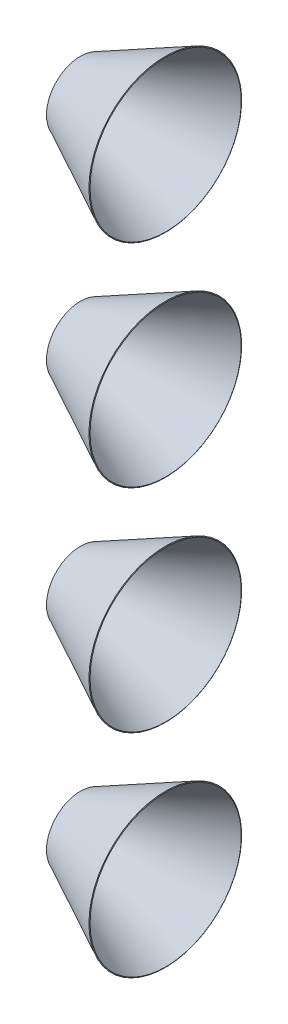
ISO-10303-21;
HEADER;
FILE_DESCRIPTION(('STEP AP214'),'2;1');
FILE_NAME('part.step','',(''),(''),'','','');
FILE_SCHEMA(('AUTOMOTIVE_DESIGN { 1 0 10303 214 1 1 1 1 }'));
ENDSEC;
DATA;
#1=APPLICATION_CONTEXT('core data for automotive mechanical design processes');
#2=APPLICATION_PROTOCOL_DEFINITION('international standard','automotive_design',2000,#1);
#3=PRODUCT_CONTEXT('',#1,'mechanical');
#4=PRODUCT('Part','Part','',(#3));
#5=PRODUCT_RELATED_PRODUCT_CATEGORY('part','',(#4));
#6=PRODUCT_DEFINITION_FORMATION('','',#4);
#7=PRODUCT_DEFINITION_CONTEXT('part definition',#1,'design');
#8=PRODUCT_DEFINITION('design','',#6,#7);
#9=PRODUCT_DEFINITION_SHAPE('','',#8);
#10=(LENGTH_UNIT() NAMED_UNIT(*) SI_UNIT(.MILLI.,.METRE.));
#11=(NAMED_UNIT(*) PLANE_ANGLE_UNIT() SI_UNIT($,.RADIAN.));
#12=(NAMED_UNIT(*) SI_UNIT($,.STERADIAN.) SOLID_ANGLE_UNIT());
#13=UNCERTAINTY_MEASURE_WITH_UNIT(LENGTH_MEASURE(1.E-05),#10,'distance_accuracy_value','');
#14=(GEOMETRIC_REPRESENTATION_CONTEXT(3) GLOBAL_UNCERTAINTY_ASSIGNED_CONTEXT((#13)) GLOBAL_UNIT_ASSIGNED_CONTEXT((#10,
#11,#12)) REPRESENTATION_CONTEXT('',''));
#15=CARTESIAN_POINT('',(0.,0.,0.));
#16=DIRECTION('',(0.,0.,1.));
#17=DIRECTION('',(1.,0.,0.));
#18=AXIS2_PLACEMENT_3D('',#15,#16,#17);
#19=CARTESIAN_POINT('',(1200.4472135955,375.,0.));
#20=DIRECTION('',(1.,0.,0.));
#21=DIRECTION('',(0.,0.,-1.));
#22=AXIS2_PLACEMENT_3D('',#19,#20,#21);
#23=CONICAL_SURFACE('',#22,39.1055728090001,0.463647609000806);
#24=CARTESIAN_POINT('',(1300.4472135955,375.,0.));
#25=DIRECTION('',(-1.,0.,0.));
#26=DIRECTION('',(0.,0.,1.));
#27=AXIS2_PLACEMENT_3D('',#24,#25,#26);
#28=CIRCLE('',#27,89.1055728090001);
#29=CARTESIAN_POINT('',(1300.4472135955,375.,89.1055728090001));
#30=VERTEX_POINT('',#29);
#31=EDGE_CURVE('E56',#30,#30,#28,.T.);
#32=ORIENTED_EDGE('',*,*,#31,.F.);
#33=EDGE_LOOP('',(#32));
#34=FACE_BOUND('',#33,.T.);
#35=CARTESIAN_POINT('',(1200.4472135955,375.,0.));
#36=DIRECTION('',(-1.,0.,0.));
#37=DIRECTION('',(0.,0.,1.));
#38=AXIS2_PLACEMENT_3D('',#35,#36,#37);
#39=CIRCLE('',#38,39.1055728090001);
#40=CARTESIAN_POINT('',(1200.4472135955,375.,39.1055728090001));
#41=VERTEX_POINT('',#40);
#42=EDGE_CURVE('E11',#41,#41,#39,.T.);
#43=ORIENTED_EDGE('',*,*,#42,.T.);
#44=EDGE_LOOP('',(#43));
#45=FACE_BOUND('',#44,.T.);
#46=ADVANCED_FACE('F42',(#34,#45),#23,.F.);
#47=CARTESIAN_POINT('',(1200.4472135955,375.,0.));
#48=DIRECTION('',(-1.,0.,0.));
#49=DIRECTION('',(0.,0.,1.));
#50=AXIS2_PLACEMENT_3D('',#47,#48,#49);
#51=CONICAL_SURFACE('',#50,39.1055728090001,1.10714871779402);
#52=CARTESIAN_POINT('',(1200.,375.,0.));
#53=DIRECTION('',(-1.,0.,0.));
#54=DIRECTION('',(0.,0.,1.));
#55=AXIS2_PLACEMENT_3D('',#52,#53,#54);
#56=CIRCLE('',#55,40.);
#57=CARTESIAN_POINT('',(1200.,375.,40.));
#58=VERTEX_POINT('',#57);
#59=EDGE_CURVE('E48',#58,#58,#56,.T.);
#60=ORIENTED_EDGE('',*,*,#59,.T.);
#61=EDGE_LOOP('',(#60));
#62=FACE_BOUND('',#61,.T.);
#63=ORIENTED_EDGE('',*,*,#42,.F.);
#64=EDGE_LOOP('',(#63));
#65=FACE_BOUND('',#64,.T.);
#66=ADVANCED_FACE('F66',(#62,#65),#51,.F.);
#67=CARTESIAN_POINT('',(1200.,375.,0.));
#68=DIRECTION('',(1.,0.,0.));
#69=DIRECTION('',(0.,0.,-1.));
#70=AXIS2_PLACEMENT_3D('',#67,#68,#69);
#71=CONICAL_SURFACE('',#70,40.,0.463647609000806);
#72=CARTESIAN_POINT('',(1300.,375.,0.));
#73=DIRECTION('',(-1.,0.,0.));
#74=DIRECTION('',(0.,0.,1.));
#75=AXIS2_PLACEMENT_3D('',#72,#73,#74);
#76=CIRCLE('',#75,90.);
#77=CARTESIAN_POINT('',(1300.,375.,90.));
#78=VERTEX_POINT('',#77);
#79=EDGE_CURVE('E52',#78,#78,#76,.T.);
#80=ORIENTED_EDGE('',*,*,#79,.T.);
#81=EDGE_LOOP('',(#80));
#82=FACE_BOUND('',#81,.T.);
#83=ORIENTED_EDGE('',*,*,#59,.F.);
#84=EDGE_LOOP('',(#83));
#85=FACE_BOUND('',#84,.T.);
#86=ADVANCED_FACE('F70',(#82,#85),#71,.T.);
#87=CARTESIAN_POINT('',(1300.,375.,0.));
#88=DIRECTION('',(-1.,0.,0.));
#89=DIRECTION('',(0.,0.,1.));
#90=AXIS2_PLACEMENT_3D('',#87,#88,#89);
#91=CONICAL_SURFACE('',#90,90.,1.10714871779402);
#92=ORIENTED_EDGE('',*,*,#31,.T.);
#93=EDGE_LOOP('',(#92));
#94=FACE_BOUND('',#93,.T.);
#95=ORIENTED_EDGE('',*,*,#79,.F.);
#96=EDGE_LOOP('',(#95));
#97=FACE_BOUND('',#96,.T.);
#98=ADVANCED_FACE('F62',(#94,#97),#91,.T.);
#99=CLOSED_SHELL('',(#46,#66,#86,#98));
#100=MANIFOLD_SOLID_BREP('B2',#99);
#101=CARTESIAN_POINT('',(1200.4472135955,125.,0.));
#102=DIRECTION('',(1.,0.,0.));
#103=DIRECTION('',(0.,0.,-1.));
#104=AXIS2_PLACEMENT_3D('',#101,#102,#103);
#105=CONICAL_SURFACE('',#104,39.1055728090001,0.463647609000806);
#106=CARTESIAN_POINT('',(1300.4472135955,125.,0.));
#107=DIRECTION('',(-1.,0.,0.));
#108=DIRECTION('',(0.,0.,1.));
#109=AXIS2_PLACEMENT_3D('',#106,#107,#108);
#110=CIRCLE('',#109,89.1055728090001);
#111=CARTESIAN_POINT('',(1300.4472135955,125.,89.1055728090001));
#112=VERTEX_POINT('',#111);
#113=EDGE_CURVE('E125',#112,#112,#110,.T.);
#114=ORIENTED_EDGE('',*,*,#113,.F.);
#115=EDGE_LOOP('',(#114));
#116=FACE_BOUND('',#115,.T.);
#117=CARTESIAN_POINT('',(1200.4472135955,125.,0.));
#118=DIRECTION('',(-1.,0.,0.));
#119=DIRECTION('',(0.,0.,1.));
#120=AXIS2_PLACEMENT_3D('',#117,#118,#119);
#121=CIRCLE('',#120,39.1055728090001);
#122=CARTESIAN_POINT('',(1200.4472135955,125.,39.1055728090001));
#123=VERTEX_POINT('',#122);
#124=EDGE_CURVE('E41',#123,#123,#121,.T.);
#125=ORIENTED_EDGE('',*,*,#124,.T.);
#126=EDGE_LOOP('',(#125));
#127=FACE_BOUND('',#126,.T.);
#128=ADVANCED_FACE('F111',(#116,#127),#105,.F.);
#129=CARTESIAN_POINT('',(1200.4472135955,125.,0.));
#130=DIRECTION('',(-1.,0.,0.));
#131=DIRECTION('',(0.,0.,1.));
#132=AXIS2_PLACEMENT_3D('',#129,#130,#131);
#133=CONICAL_SURFACE('',#132,39.1055728090001,1.10714871779402);
#134=CARTESIAN_POINT('',(1200.,125.,0.));
#135=DIRECTION('',(-1.,0.,0.));
#136=DIRECTION('',(0.,0.,1.));
#137=AXIS2_PLACEMENT_3D('',#134,#135,#136);
#138=CIRCLE('',#137,40.);
#139=CARTESIAN_POINT('',(1200.,125.,40.));
#140=VERTEX_POINT('',#139);
#141=EDGE_CURVE('E117',#140,#140,#138,.T.);
#142=ORIENTED_EDGE('',*,*,#141,.T.);
#143=EDGE_LOOP('',(#142));
#144=FACE_BOUND('',#143,.T.);
#145=ORIENTED_EDGE('',*,*,#124,.F.);
#146=EDGE_LOOP('',(#145));
#147=FACE_BOUND('',#146,.T.);
#148=ADVANCED_FACE('F135',(#144,#147),#133,.F.);
#149=CARTESIAN_POINT('',(1200.,125.,0.));
#150=DIRECTION('',(1.,0.,0.));
#151=DIRECTION('',(0.,0.,-1.));
#152=AXIS2_PLACEMENT_3D('',#149,#150,#151);
#153=CONICAL_SURFACE('',#152,40.,0.463647609000806);
#154=CARTESIAN_POINT('',(1300.,125.,0.));
#155=DIRECTION('',(-1.,0.,0.));
#156=DIRECTION('',(0.,0.,1.));
#157=AXIS2_PLACEMENT_3D('',#154,#155,#156);
#158=CIRCLE('',#157,90.);
#159=CARTESIAN_POINT('',(1300.,125.,90.));
#160=VERTEX_POINT('',#159);
#161=EDGE_CURVE('E121',#160,#160,#158,.T.);
#162=ORIENTED_EDGE('',*,*,#161,.T.);
#163=EDGE_LOOP('',(#162));
#164=FACE_BOUND('',#163,.T.);
#165=ORIENTED_EDGE('',*,*,#141,.F.);
#166=EDGE_LOOP('',(#165));
#167=FACE_BOUND('',#166,.T.);
#168=ADVANCED_FACE('F139',(#164,#167),#153,.T.);
#169=CARTESIAN_POINT('',(1300.,125.,0.));
#170=DIRECTION('',(-1.,0.,0.));
#171=DIRECTION('',(0.,0.,1.));
#172=AXIS2_PLACEMENT_3D('',#169,#170,#171);
#173=CONICAL_SURFACE('',#172,90.,1.10714871779402);
#174=ORIENTED_EDGE('',*,*,#113,.T.);
#175=EDGE_LOOP('',(#174));
#176=FACE_BOUND('',#175,.T.);
#177=ORIENTED_EDGE('',*,*,#161,.F.);
#178=EDGE_LOOP('',(#177));
#179=FACE_BOUND('',#178,.T.);
#180=ADVANCED_FACE('F131',(#176,#179),#173,.T.);
#181=CLOSED_SHELL('',(#128,#148,#168,#180));
#182=MANIFOLD_SOLID_BREP('B6',#181);
#183=CARTESIAN_POINT('',(1200.4472135955,-125.,0.));
#184=DIRECTION('',(1.,0.,0.));
#185=DIRECTION('',(0.,0.,-1.));
#186=AXIS2_PLACEMENT_3D('',#183,#184,#185);
#187=CONICAL_SURFACE('',#186,39.1055728090001,0.463647609000806);
#188=CARTESIAN_POINT('',(1300.4472135955,-125.,0.));
#189=DIRECTION('',(-1.,0.,0.));
#190=DIRECTION('',(0.,0.,1.));
#191=AXIS2_PLACEMENT_3D('',#188,#189,#190);
#192=CIRCLE('',#191,89.1055728090001);
#193=CARTESIAN_POINT('',(1300.4472135955,-125.,89.1055728090001));
#194=VERTEX_POINT('',#193);
#195=EDGE_CURVE('E193',#194,#194,#192,.T.);
#196=ORIENTED_EDGE('',*,*,#195,.F.);
#197=EDGE_LOOP('',(#196));
#198=FACE_BOUND('',#197,.T.);
#199=CARTESIAN_POINT('',(1200.4472135955,-125.,0.));
#200=DIRECTION('',(-1.,0.,0.));
#201=DIRECTION('',(0.,0.,1.));
#202=AXIS2_PLACEMENT_3D('',#199,#200,#201);
#203=CIRCLE('',#202,39.1055728090001);
#204=CARTESIAN_POINT('',(1200.4472135955,-125.,39.1055728090001));
#205=VERTEX_POINT('',#204);
#206=EDGE_CURVE('E110',#205,#205,#203,.T.);
#207=ORIENTED_EDGE('',*,*,#206,.T.);
#208=EDGE_LOOP('',(#207));
#209=FACE_BOUND('',#208,.T.);
#210=ADVANCED_FACE('F179',(#198,#209),#187,.F.);
#211=CARTESIAN_POINT('',(1200.4472135955,-125.,0.));
#212=DIRECTION('',(-1.,0.,0.));
#213=DIRECTION('',(0.,0.,1.));
#214=AXIS2_PLACEMENT_3D('',#211,#212,#213);
#215=CONICAL_SURFACE('',#214,39.1055728090001,1.10714871779402);
#216=CARTESIAN_POINT('',(1200.,-125.,0.));
#217=DIRECTION('',(-1.,0.,0.));
#218=DIRECTION('',(0.,0.,1.));
#219=AXIS2_PLACEMENT_3D('',#216,#217,#218);
#220=CIRCLE('',#219,40.);
#221=CARTESIAN_POINT('',(1200.,-125.,40.));
#222=VERTEX_POINT('',#221);
#223=EDGE_CURVE('E185',#222,#222,#220,.T.);
#224=ORIENTED_EDGE('',*,*,#223,.T.);
#225=EDGE_LOOP('',(#224));
#226=FACE_BOUND('',#225,.T.);
#227=ORIENTED_EDGE('',*,*,#206,.F.);
#228=EDGE_LOOP('',(#227));
#229=FACE_BOUND('',#228,.T.);
#230=ADVANCED_FACE('F203',(#226,#229),#215,.F.);
#231=CARTESIAN_POINT('',(1200.,-125.,0.));
#232=DIRECTION('',(1.,0.,0.));
#233=DIRECTION('',(0.,0.,-1.));
#234=AXIS2_PLACEMENT_3D('',#231,#232,#233);
#235=CONICAL_SURFACE('',#234,40.,0.463647609000806);
#236=CARTESIAN_POINT('',(1300.,-125.,0.));
#237=DIRECTION('',(-1.,0.,0.));
#238=DIRECTION('',(0.,0.,1.));
#239=AXIS2_PLACEMENT_3D('',#236,#237,#238);
#240=CIRCLE('',#239,90.);
#241=CARTESIAN_POINT('',(1300.,-125.,90.));
#242=VERTEX_POINT('',#241);
#243=EDGE_CURVE('E189',#242,#242,#240,.T.);
#244=ORIENTED_EDGE('',*,*,#243,.T.);
#245=EDGE_LOOP('',(#244));
#246=FACE_BOUND('',#245,.T.);
#247=ORIENTED_EDGE('',*,*,#223,.F.);
#248=EDGE_LOOP('',(#247));
#249=FACE_BOUND('',#248,.T.);
#250=ADVANCED_FACE('F207',(#246,#249),#235,.T.);
#251=CARTESIAN_POINT('',(1300.,-125.,0.));
#252=DIRECTION('',(-1.,0.,0.));
#253=DIRECTION('',(0.,0.,1.));
#254=AXIS2_PLACEMENT_3D('',#251,#252,#253);
#255=CONICAL_SURFACE('',#254,90.,1.10714871779402);
#256=ORIENTED_EDGE('',*,*,#195,.T.);
#257=EDGE_LOOP('',(#256));
#258=FACE_BOUND('',#257,.T.);
#259=ORIENTED_EDGE('',*,*,#243,.F.);
#260=EDGE_LOOP('',(#259));
#261=FACE_BOUND('',#260,.T.);
#262=ADVANCED_FACE('F199',(#258,#261),#255,.T.);
#263=CLOSED_SHELL('',(#210,#230,#250,#262));
#264=MANIFOLD_SOLID_BREP('B36',#263);
#265=CARTESIAN_POINT('',(1200.4472135955,-375.,0.));
#266=DIRECTION('',(1.,0.,0.));
#267=DIRECTION('',(0.,0.,-1.));
#268=AXIS2_PLACEMENT_3D('',#265,#266,#267);
#269=CONICAL_SURFACE('',#268,39.1055728090001,0.463647609000806);
#270=CARTESIAN_POINT('',(1300.4472135955,-375.,0.));
#271=DIRECTION('',(-1.,0.,0.));
#272=DIRECTION('',(0.,0.,1.));
#273=AXIS2_PLACEMENT_3D('',#270,#271,#272);
#274=CIRCLE('',#273,89.1055728090001);
#275=CARTESIAN_POINT('',(1300.4472135955,-375.,89.1055728090001));
#276=VERTEX_POINT('',#275);
#277=EDGE_CURVE('E254',#276,#276,#274,.T.);
#278=ORIENTED_EDGE('',*,*,#277,.F.);
#279=EDGE_LOOP('',(#278));
#280=FACE_BOUND('',#279,.T.);
#281=CARTESIAN_POINT('',(1200.4472135955,-375.,0.));
#282=DIRECTION('',(-1.,0.,0.));
#283=DIRECTION('',(0.,0.,1.));
#284=AXIS2_PLACEMENT_3D('',#281,#282,#283);
#285=CIRCLE('',#284,39.1055728090001);
#286=CARTESIAN_POINT('',(1200.4472135955,-375.,39.1055728090001));
#287=VERTEX_POINT('',#286);
#288=EDGE_CURVE('E178',#287,#287,#285,.T.);
#289=ORIENTED_EDGE('',*,*,#288,.T.);
#290=EDGE_LOOP('',(#289));
#291=FACE_BOUND('',#290,.T.);
#292=ADVANCED_FACE('F240',(#280,#291),#269,.F.);
#293=CARTESIAN_POINT('',(1200.4472135955,-375.,0.));
#294=DIRECTION('',(-1.,0.,0.));
#295=DIRECTION('',(0.,0.,1.));
#296=AXIS2_PLACEMENT_3D('',#293,#294,#295);
#297=CONICAL_SURFACE('',#296,39.1055728090001,1.10714871779402);
#298=CARTESIAN_POINT('',(1200.,-375.,0.));
#299=DIRECTION('',(-1.,0.,0.));
#300=DIRECTION('',(0.,0.,1.));
#301=AXIS2_PLACEMENT_3D('',#298,#299,#300);
#302=CIRCLE('',#301,40.);
#303=CARTESIAN_POINT('',(1200.,-375.,40.));
#304=VERTEX_POINT('',#303);
#305=EDGE_CURVE('E246',#304,#304,#302,.T.);
#306=ORIENTED_EDGE('',*,*,#305,.T.);
#307=EDGE_LOOP('',(#306));
#308=FACE_BOUND('',#307,.T.);
#309=ORIENTED_EDGE('',*,*,#288,.F.);
#310=EDGE_LOOP('',(#309));
#311=FACE_BOUND('',#310,.T.);
#312=ADVANCED_FACE('F264',(#308,#311),#297,.F.);
#313=CARTESIAN_POINT('',(1200.,-375.,0.));
#314=DIRECTION('',(1.,0.,0.));
#315=DIRECTION('',(0.,0.,-1.));
#316=AXIS2_PLACEMENT_3D('',#313,#314,#315);
#317=CONICAL_SURFACE('',#316,40.,0.463647609000806);
#318=CARTESIAN_POINT('',(1300.,-375.,0.));
#319=DIRECTION('',(-1.,0.,0.));
#320=DIRECTION('',(0.,0.,1.));
#321=AXIS2_PLACEMENT_3D('',#318,#319,#320);
#322=CIRCLE('',#321,90.);
#323=CARTESIAN_POINT('',(1300.,-375.,90.));
#324=VERTEX_POINT('',#323);
#325=EDGE_CURVE('E250',#324,#324,#322,.T.);
#326=ORIENTED_EDGE('',*,*,#325,.T.);
#327=EDGE_LOOP('',(#326));
#328=FACE_BOUND('',#327,.T.);
#329=ORIENTED_EDGE('',*,*,#305,.F.);
#330=EDGE_LOOP('',(#329));
#331=FACE_BOUND('',#330,.T.);
#332=ADVANCED_FACE('F268',(#328,#331),#317,.T.);
#333=CARTESIAN_POINT('',(1300.,-375.,0.));
#334=DIRECTION('',(-1.,0.,0.));
#335=DIRECTION('',(0.,0.,1.));
#336=AXIS2_PLACEMENT_3D('',#333,#334,#335);
#337=CONICAL_SURFACE('',#336,90.,1.10714871779402);
#338=ORIENTED_EDGE('',*,*,#277,.T.);
#339=EDGE_LOOP('',(#338));
#340=FACE_BOUND('',#339,.T.);
#341=ORIENTED_EDGE('',*,*,#325,.F.);
#342=EDGE_LOOP('',(#341));
#343=FACE_BOUND('',#342,.T.);
#344=ADVANCED_FACE('F260',(#340,#343),#337,.T.);
#345=CLOSED_SHELL('',(#292,#312,#332,#344));
#346=MANIFOLD_SOLID_BREP('B105',#345);
#347=ADVANCED_BREP_SHAPE_REPRESENTATION('',(#18,#100,#182,#264,#346),#14);
#348=SHAPE_DEFINITION_REPRESENTATION(#9,#347);
ENDSEC;
END-ISO-10303-21;
